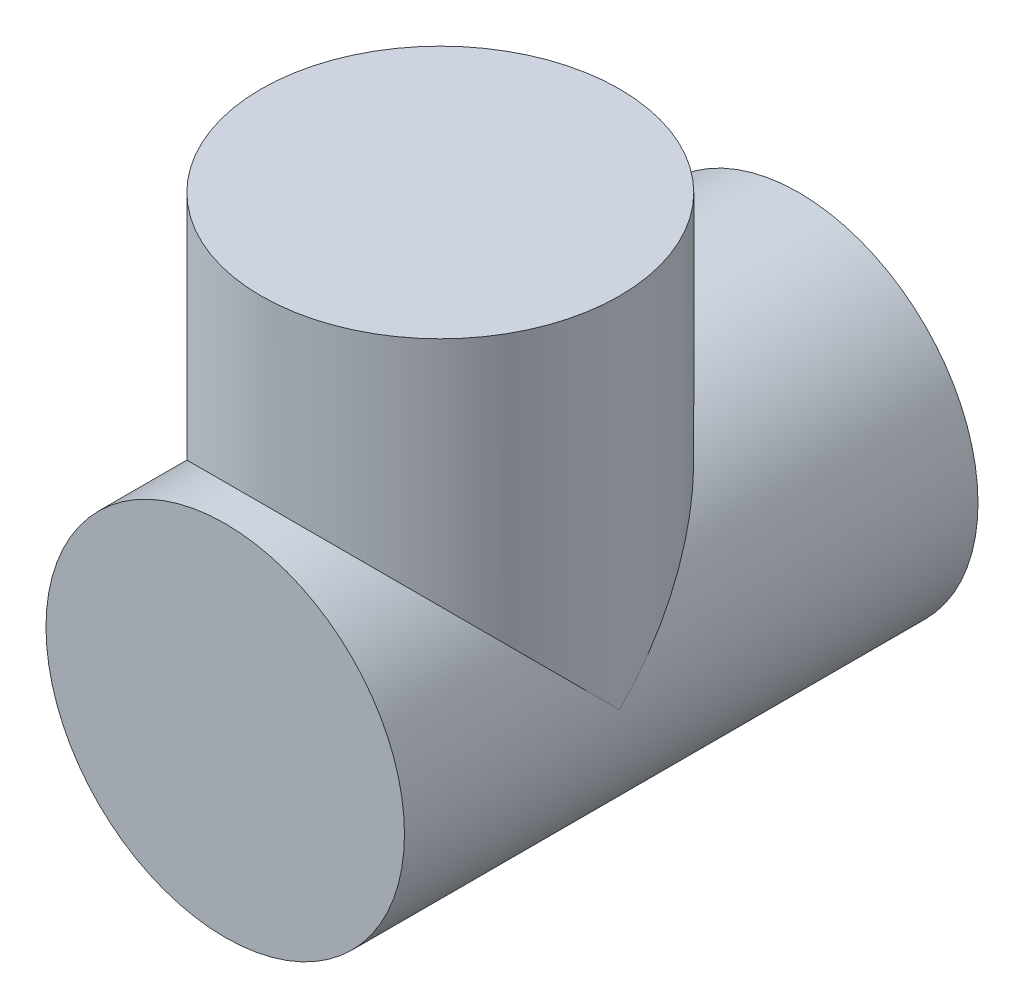
ISO-10303-21;
HEADER;
FILE_DESCRIPTION(('STEP AP214'),'2;1');
FILE_NAME('part.step','',(''),(''),'','','');
FILE_SCHEMA(('AUTOMOTIVE_DESIGN { 1 0 10303 214 1 1 1 1 }'));
ENDSEC;
DATA;
#1=APPLICATION_CONTEXT('core data for automotive mechanical design processes');
#2=APPLICATION_PROTOCOL_DEFINITION('international standard','automotive_design',2000,#1);
#3=PRODUCT_CONTEXT('',#1,'mechanical');
#4=PRODUCT('Part','Part','',(#3));
#5=PRODUCT_RELATED_PRODUCT_CATEGORY('part','',(#4));
#6=PRODUCT_DEFINITION_FORMATION('','',#4);
#7=PRODUCT_DEFINITION_CONTEXT('part definition',#1,'design');
#8=PRODUCT_DEFINITION('design','',#6,#7);
#9=PRODUCT_DEFINITION_SHAPE('','',#8);
#10=(LENGTH_UNIT() NAMED_UNIT(*) SI_UNIT(.MILLI.,.METRE.));
#11=(NAMED_UNIT(*) PLANE_ANGLE_UNIT() SI_UNIT($,.RADIAN.));
#12=(NAMED_UNIT(*) SI_UNIT($,.STERADIAN.) SOLID_ANGLE_UNIT());
#13=UNCERTAINTY_MEASURE_WITH_UNIT(LENGTH_MEASURE(1.E-05),#10,'distance_accuracy_value','');
#14=(GEOMETRIC_REPRESENTATION_CONTEXT(3) GLOBAL_UNCERTAINTY_ASSIGNED_CONTEXT((#13)) GLOBAL_UNIT_ASSIGNED_CONTEXT((#10,
#11,#12)) REPRESENTATION_CONTEXT('',''));
#15=CARTESIAN_POINT('',(0.,0.,0.));
#16=DIRECTION('',(0.,0.,1.));
#17=DIRECTION('',(1.,0.,0.));
#18=AXIS2_PLACEMENT_3D('',#15,#16,#17);
#19=CARTESIAN_POINT('',(0.,0.,800.));
#20=DIRECTION('',(0.,0.,-1.));
#21=DIRECTION('',(-1.,0.,0.));
#22=AXIS2_PLACEMENT_3D('',#19,#20,#21);
#23=CYLINDRICAL_SURFACE('',#22,250.);
#24=CARTESIAN_POINT('',(0.,0.,0.));
#25=DIRECTION('',(0.,0.,1.));
#26=DIRECTION('',(1.,0.,0.));
#27=AXIS2_PLACEMENT_3D('',#24,#25,#26);
#28=CIRCLE('',#27,250.);
#29=CARTESIAN_POINT('',(250.,0.,0.));
#30=VERTEX_POINT('',#29);
#31=EDGE_CURVE('E53',#30,#30,#28,.T.);
#32=ORIENTED_EDGE('',*,*,#31,.T.);
#33=EDGE_LOOP('',(#32));
#34=FACE_BOUND('',#33,.T.);
#35=CARTESIAN_POINT('',(0.,0.,800.));
#36=DIRECTION('',(0.,0.,1.));
#37=DIRECTION('',(1.,0.,0.));
#38=AXIS2_PLACEMENT_3D('',#35,#36,#37);
#39=CIRCLE('',#38,250.);
#40=CARTESIAN_POINT('',(250.,0.,800.));
#41=VERTEX_POINT('',#40);
#42=EDGE_CURVE('E51',#41,#41,#39,.T.);
#43=ORIENTED_EDGE('',*,*,#42,.F.);
#44=EDGE_LOOP('',(#43));
#45=FACE_BOUND('',#44,.T.);
#46=CARTESIAN_POINT('',(0.,0.,500.));
#47=DIRECTION('',(0.,-0.707106781186547,-0.707106781186547));
#48=DIRECTION('',(0.,0.707106781186547,-0.707106781186547));
#49=AXIS2_PLACEMENT_3D('',#46,#47,#48);
#50=ELLIPSE('',#49,353.553390593274,250.);
#51=CARTESIAN_POINT('',(250.,0.,500.));
#52=VERTEX_POINT('',#51);
#53=CARTESIAN_POINT('',(-250.,0.,500.));
#54=VERTEX_POINT('',#53);
#55=EDGE_CURVE('E11',#52,#54,#50,.F.);
#56=ORIENTED_EDGE('',*,*,#55,.F.);
#57=CARTESIAN_POINT('',(0.,0.,500.));
#58=DIRECTION('',(0.,0.707106781186547,-0.707106781186547));
#59=DIRECTION('',(0.,-0.707106781186547,-0.707106781186547));
#60=AXIS2_PLACEMENT_3D('',#57,#58,#59);
#61=ELLIPSE('',#60,353.553390593274,250.);
#62=EDGE_CURVE('E43',#54,#52,#61,.T.);
#63=ORIENTED_EDGE('',*,*,#62,.F.);
#64=EDGE_LOOP('',(#56,#63));
#65=FACE_BOUND('',#64,.T.);
#66=ADVANCED_FACE('F36',(#34,#45,#65),#23,.T.);
#67=CARTESIAN_POINT('',(0.,0.,800.));
#68=DIRECTION('',(0.,0.,1.));
#69=DIRECTION('',(1.,0.,0.));
#70=AXIS2_PLACEMENT_3D('',#67,#68,#69);
#71=PLANE('',#70);
#72=ORIENTED_EDGE('',*,*,#42,.T.);
#73=EDGE_LOOP('',(#72));
#74=FACE_BOUND('',#73,.T.);
#75=ADVANCED_FACE('F72',(#74),#71,.T.);
#76=CARTESIAN_POINT('',(0.,0.,0.));
#77=DIRECTION('',(0.,0.,1.));
#78=DIRECTION('',(1.,0.,0.));
#79=AXIS2_PLACEMENT_3D('',#76,#77,#78);
#80=PLANE('',#79);
#81=ORIENTED_EDGE('',*,*,#31,.F.);
#82=EDGE_LOOP('',(#81));
#83=FACE_BOUND('',#82,.T.);
#84=ADVANCED_FACE('F65',(#83),#80,.F.);
#85=CARTESIAN_POINT('',(0.,500.,500.));
#86=DIRECTION('',(0.,-1.,0.));
#87=DIRECTION('',(0.,0.,-1.));
#88=AXIS2_PLACEMENT_3D('',#85,#86,#87);
#89=CYLINDRICAL_SURFACE('',#88,250.);
#90=CARTESIAN_POINT('',(0.,500.,500.));
#91=DIRECTION('',(0.,1.,0.));
#92=DIRECTION('',(0.,0.,1.));
#93=AXIS2_PLACEMENT_3D('',#90,#91,#92);
#94=CIRCLE('',#93,250.);
#95=CARTESIAN_POINT('',(0.,500.,750.));
#96=VERTEX_POINT('',#95);
#97=EDGE_CURVE('E57',#96,#96,#94,.T.);
#98=ORIENTED_EDGE('',*,*,#97,.F.);
#99=EDGE_LOOP('',(#98));
#100=FACE_BOUND('',#99,.T.);
#101=ORIENTED_EDGE('',*,*,#62,.T.);
#102=ORIENTED_EDGE('',*,*,#55,.T.);
#103=EDGE_LOOP('',(#101,#102));
#104=FACE_BOUND('',#103,.T.);
#105=ADVANCED_FACE('F50',(#100,#104),#89,.T.);
#106=CARTESIAN_POINT('',(0.,500.,500.));
#107=DIRECTION('',(0.,1.,0.));
#108=DIRECTION('',(0.,0.,1.));
#109=AXIS2_PLACEMENT_3D('',#106,#107,#108);
#110=PLANE('',#109);
#111=ORIENTED_EDGE('',*,*,#97,.T.);
#112=EDGE_LOOP('',(#111));
#113=FACE_BOUND('',#112,.T.);
#114=ADVANCED_FACE('F62',(#113),#110,.T.);
#115=CLOSED_SHELL('',(#66,#75,#84,#105,#114));
#116=MANIFOLD_SOLID_BREP('B2',#115);
#117=ADVANCED_BREP_SHAPE_REPRESENTATION('',(#18,#116),#14);
#118=SHAPE_DEFINITION_REPRESENTATION(#9,#117);
ENDSEC;
END-ISO-10303-21;
